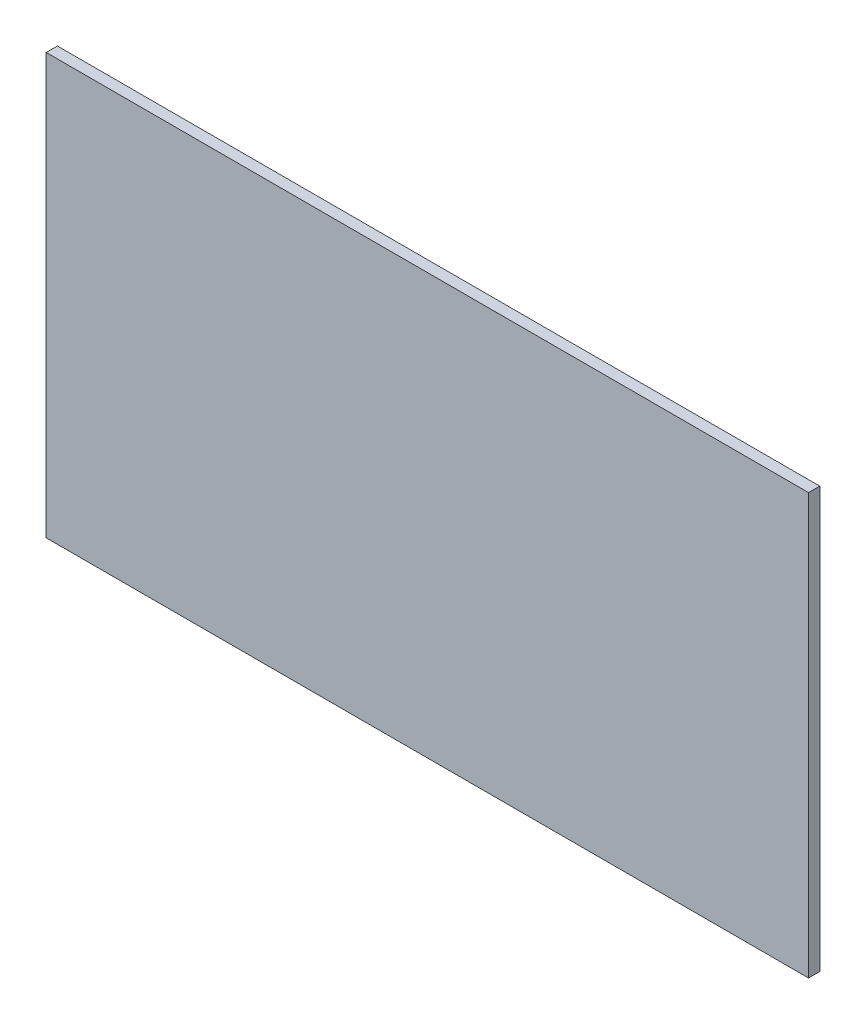
ISO-10303-21;
HEADER;
FILE_DESCRIPTION(('STEP AP214'),'2;1');
FILE_NAME('part.step','',(''),(''),'','','');
FILE_SCHEMA(('AUTOMOTIVE_DESIGN { 1 0 10303 214 1 1 1 1 }'));
ENDSEC;
DATA;
#1=APPLICATION_CONTEXT('core data for automotive mechanical design processes');
#2=APPLICATION_PROTOCOL_DEFINITION('international standard','automotive_design',2000,#1);
#3=PRODUCT_CONTEXT('',#1,'mechanical');
#4=PRODUCT('Part','Part','',(#3));
#5=PRODUCT_RELATED_PRODUCT_CATEGORY('part','',(#4));
#6=PRODUCT_DEFINITION_FORMATION('','',#4);
#7=PRODUCT_DEFINITION_CONTEXT('part definition',#1,'design');
#8=PRODUCT_DEFINITION('design','',#6,#7);
#9=PRODUCT_DEFINITION_SHAPE('','',#8);
#10=(LENGTH_UNIT() NAMED_UNIT(*) SI_UNIT(.MILLI.,.METRE.));
#11=(NAMED_UNIT(*) PLANE_ANGLE_UNIT() SI_UNIT($,.RADIAN.));
#12=(NAMED_UNIT(*) SI_UNIT($,.STERADIAN.) SOLID_ANGLE_UNIT());
#13=UNCERTAINTY_MEASURE_WITH_UNIT(LENGTH_MEASURE(1.E-05),#10,'distance_accuracy_value','');
#14=(GEOMETRIC_REPRESENTATION_CONTEXT(3) GLOBAL_UNCERTAINTY_ASSIGNED_CONTEXT((#13)) GLOBAL_UNIT_ASSIGNED_CONTEXT((#10,
#11,#12)) REPRESENTATION_CONTEXT('',''));
#15=CARTESIAN_POINT('',(0.,0.,0.));
#16=DIRECTION('',(0.,0.,1.));
#17=DIRECTION('',(1.,0.,0.));
#18=AXIS2_PLACEMENT_3D('',#15,#16,#17);
#19=CARTESIAN_POINT('',(136.,75.,4.));
#20=DIRECTION('',(-1.,0.,0.));
#21=DIRECTION('',(0.,0.,1.));
#22=AXIS2_PLACEMENT_3D('',#19,#20,#21);
#23=PLANE('',#22);
#24=DIRECTION('',(0.,1.,0.));
#25=VECTOR('',#24,1.);
#26=CARTESIAN_POINT('',(136.,75.,0.));
#27=LINE('',#26,#25);
#28=CARTESIAN_POINT('',(136.,-75.,0.));
#29=VERTEX_POINT('',#28);
#30=CARTESIAN_POINT('',(136.,75.,0.));
#31=VERTEX_POINT('',#30);
#32=EDGE_CURVE('E96',#29,#31,#27,.T.);
#33=ORIENTED_EDGE('',*,*,#32,.T.);
#34=DIRECTION('',(0.,0.,-1.));
#35=VECTOR('',#34,1.);
#36=CARTESIAN_POINT('',(136.,75.,4.));
#37=LINE('',#36,#35);
#38=CARTESIAN_POINT('',(136.,75.,4.));
#39=VERTEX_POINT('',#38);
#40=EDGE_CURVE('E11',#39,#31,#37,.T.);
#41=ORIENTED_EDGE('',*,*,#40,.F.);
#42=DIRECTION('',(0.,1.,0.));
#43=VECTOR('',#42,1.);
#44=CARTESIAN_POINT('',(136.,75.,4.));
#45=LINE('',#44,#43);
#46=CARTESIAN_POINT('',(136.,-75.,4.));
#47=VERTEX_POINT('',#46);
#48=EDGE_CURVE('E84',#47,#39,#45,.T.);
#49=ORIENTED_EDGE('',*,*,#48,.F.);
#50=DIRECTION('',(0.,0.,-1.));
#51=VECTOR('',#50,1.);
#52=CARTESIAN_POINT('',(136.,-75.,4.));
#53=LINE('',#52,#51);
#54=EDGE_CURVE('E92',#47,#29,#53,.T.);
#55=ORIENTED_EDGE('',*,*,#54,.T.);
#56=EDGE_LOOP('',(#33,#41,#49,#55));
#57=FACE_BOUND('',#56,.T.);
#58=ADVANCED_FACE('F33',(#57),#23,.F.);
#59=CARTESIAN_POINT('',(-136.,75.,4.));
#60=DIRECTION('',(0.,-1.,0.));
#61=DIRECTION('',(0.,0.,-1.));
#62=AXIS2_PLACEMENT_3D('',#59,#60,#61);
#63=PLANE('',#62);
#64=DIRECTION('',(-1.,0.,0.));
#65=VECTOR('',#64,1.);
#66=CARTESIAN_POINT('',(-136.,75.,0.));
#67=LINE('',#66,#65);
#68=CARTESIAN_POINT('',(-136.,75.,0.));
#69=VERTEX_POINT('',#68);
#70=EDGE_CURVE('E88',#31,#69,#67,.T.);
#71=ORIENTED_EDGE('',*,*,#70,.T.);
#72=DIRECTION('',(0.,0.,-1.));
#73=VECTOR('',#72,1.);
#74=CARTESIAN_POINT('',(-136.,75.,4.));
#75=LINE('',#74,#73);
#76=CARTESIAN_POINT('',(-136.,75.,4.));
#77=VERTEX_POINT('',#76);
#78=EDGE_CURVE('E41',#77,#69,#75,.T.);
#79=ORIENTED_EDGE('',*,*,#78,.F.);
#80=DIRECTION('',(-1.,0.,0.));
#81=VECTOR('',#80,1.);
#82=CARTESIAN_POINT('',(-136.,75.,4.));
#83=LINE('',#82,#81);
#84=EDGE_CURVE('E79',#39,#77,#83,.T.);
#85=ORIENTED_EDGE('',*,*,#84,.F.);
#86=ORIENTED_EDGE('',*,*,#40,.T.);
#87=EDGE_LOOP('',(#71,#79,#85,#86));
#88=FACE_BOUND('',#87,.T.);
#89=ADVANCED_FACE('F87',(#88),#63,.F.);
#90=CARTESIAN_POINT('',(-136.,75.,4.));
#91=DIRECTION('',(1.,0.,0.));
#92=DIRECTION('',(0.,0.,-1.));
#93=AXIS2_PLACEMENT_3D('',#90,#91,#92);
#94=PLANE('',#93);
#95=DIRECTION('',(0.,-1.,0.));
#96=VECTOR('',#95,1.);
#97=CARTESIAN_POINT('',(-136.,75.,0.));
#98=LINE('',#97,#96);
#99=CARTESIAN_POINT('',(-136.,-75.,0.));
#100=VERTEX_POINT('',#99);
#101=EDGE_CURVE('E66',#69,#100,#98,.T.);
#102=ORIENTED_EDGE('',*,*,#101,.T.);
#103=DIRECTION('',(0.,0.,-1.));
#104=VECTOR('',#103,1.);
#105=CARTESIAN_POINT('',(-136.,-75.,4.));
#106=LINE('',#105,#104);
#107=CARTESIAN_POINT('',(-136.,-75.,4.));
#108=VERTEX_POINT('',#107);
#109=EDGE_CURVE('E89',#108,#100,#106,.T.);
#110=ORIENTED_EDGE('',*,*,#109,.F.);
#111=DIRECTION('',(0.,-1.,0.));
#112=VECTOR('',#111,1.);
#113=CARTESIAN_POINT('',(-136.,75.,4.));
#114=LINE('',#113,#112);
#115=EDGE_CURVE('E82',#77,#108,#114,.T.);
#116=ORIENTED_EDGE('',*,*,#115,.F.);
#117=ORIENTED_EDGE('',*,*,#78,.T.);
#118=EDGE_LOOP('',(#102,#110,#116,#117));
#119=FACE_BOUND('',#118,.T.);
#120=ADVANCED_FACE('F90',(#119),#94,.F.);
#121=CARTESIAN_POINT('',(-136.,-75.,4.));
#122=DIRECTION('',(0.,1.,0.));
#123=DIRECTION('',(0.,0.,1.));
#124=AXIS2_PLACEMENT_3D('',#121,#122,#123);
#125=PLANE('',#124);
#126=DIRECTION('',(1.,0.,0.));
#127=VECTOR('',#126,1.);
#128=CARTESIAN_POINT('',(-136.,-75.,0.));
#129=LINE('',#128,#127);
#130=EDGE_CURVE('E72',#100,#29,#129,.T.);
#131=ORIENTED_EDGE('',*,*,#130,.T.);
#132=ORIENTED_EDGE('',*,*,#54,.F.);
#133=DIRECTION('',(1.,0.,0.));
#134=VECTOR('',#133,1.);
#135=CARTESIAN_POINT('',(-136.,-75.,4.));
#136=LINE('',#135,#134);
#137=EDGE_CURVE('E49',#108,#47,#136,.T.);
#138=ORIENTED_EDGE('',*,*,#137,.F.);
#139=ORIENTED_EDGE('',*,*,#109,.T.);
#140=EDGE_LOOP('',(#131,#132,#138,#139));
#141=FACE_BOUND('',#140,.T.);
#142=ADVANCED_FACE('F103',(#141),#125,.F.);
#143=CARTESIAN_POINT('',(0.,0.,4.));
#144=DIRECTION('',(0.,0.,1.));
#145=DIRECTION('',(1.,0.,0.));
#146=AXIS2_PLACEMENT_3D('',#143,#144,#145);
#147=PLANE('',#146);
#148=ORIENTED_EDGE('',*,*,#48,.T.);
#149=ORIENTED_EDGE('',*,*,#84,.T.);
#150=ORIENTED_EDGE('',*,*,#115,.T.);
#151=ORIENTED_EDGE('',*,*,#137,.T.);
#152=EDGE_LOOP('',(#148,#149,#150,#151));
#153=FACE_BOUND('',#152,.T.);
#154=ADVANCED_FACE('F80',(#153),#147,.T.);
#155=CARTESIAN_POINT('',(0.,0.,0.));
#156=DIRECTION('',(0.,0.,1.));
#157=DIRECTION('',(1.,0.,0.));
#158=AXIS2_PLACEMENT_3D('',#155,#156,#157);
#159=PLANE('',#158);
#160=ORIENTED_EDGE('',*,*,#32,.F.);
#161=ORIENTED_EDGE('',*,*,#130,.F.);
#162=ORIENTED_EDGE('',*,*,#101,.F.);
#163=ORIENTED_EDGE('',*,*,#70,.F.);
#164=EDGE_LOOP('',(#160,#161,#162,#163));
#165=FACE_BOUND('',#164,.T.);
#166=ADVANCED_FACE('F106',(#165),#159,.F.);
#167=CLOSED_SHELL('',(#58,#89,#120,#142,#154,#166));
#168=MANIFOLD_SOLID_BREP('B2',#167);
#169=ADVANCED_BREP_SHAPE_REPRESENTATION('',(#18,#168),#14);
#170=SHAPE_DEFINITION_REPRESENTATION(#9,#169);
ENDSEC;
END-ISO-10303-21;
